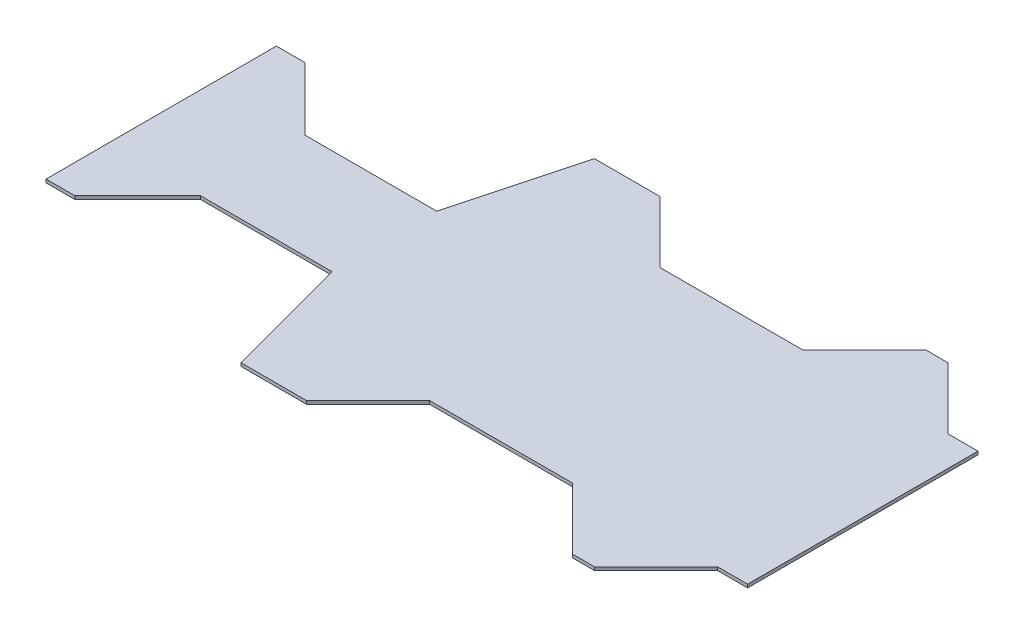
ISO-10303-21;
HEADER;
FILE_DESCRIPTION(('STEP AP214'),'2;1');
FILE_NAME('part.step','',(''),(''),'','','');
FILE_SCHEMA(('AUTOMOTIVE_DESIGN { 1 0 10303 214 1 1 1 1 }'));
ENDSEC;
DATA;
#1=APPLICATION_CONTEXT('core data for automotive mechanical design processes');
#2=APPLICATION_PROTOCOL_DEFINITION('international standard','automotive_design',2000,#1);
#3=PRODUCT_CONTEXT('',#1,'mechanical');
#4=PRODUCT('Part','Part','',(#3));
#5=PRODUCT_RELATED_PRODUCT_CATEGORY('part','',(#4));
#6=PRODUCT_DEFINITION_FORMATION('','',#4);
#7=PRODUCT_DEFINITION_CONTEXT('part definition',#1,'design');
#8=PRODUCT_DEFINITION('design','',#6,#7);
#9=PRODUCT_DEFINITION_SHAPE('','',#8);
#10=(LENGTH_UNIT() NAMED_UNIT(*) SI_UNIT(.MILLI.,.METRE.));
#11=(NAMED_UNIT(*) PLANE_ANGLE_UNIT() SI_UNIT($,.RADIAN.));
#12=(NAMED_UNIT(*) SI_UNIT($,.STERADIAN.) SOLID_ANGLE_UNIT());
#13=UNCERTAINTY_MEASURE_WITH_UNIT(LENGTH_MEASURE(1.E-05),#10,'distance_accuracy_value','');
#14=(GEOMETRIC_REPRESENTATION_CONTEXT(3) GLOBAL_UNCERTAINTY_ASSIGNED_CONTEXT((#13)) GLOBAL_UNIT_ASSIGNED_CONTEXT((#10,
#11,#12)) REPRESENTATION_CONTEXT('',''));
#15=CARTESIAN_POINT('',(0.,0.,0.));
#16=DIRECTION('',(0.,0.,1.));
#17=DIRECTION('',(1.,0.,0.));
#18=AXIS2_PLACEMENT_3D('',#15,#16,#17);
#19=CARTESIAN_POINT('',(155.575,1.5875,55.8799999999999));
#20=DIRECTION('',(0.,0.,-1.));
#21=DIRECTION('',(-1.,0.,0.));
#22=AXIS2_PLACEMENT_3D('',#19,#20,#21);
#23=PLANE('',#22);
#24=DIRECTION('',(1.,0.,0.));
#25=VECTOR('',#24,1.);
#26=CARTESIAN_POINT('',(155.575,0.,55.8799999999999));
#27=LINE('',#26,#25);
#28=CARTESIAN_POINT('',(155.575,0.,55.8799999999999));
#29=VERTEX_POINT('',#28);
#30=CARTESIAN_POINT('',(170.18,0.,55.88));
#31=VERTEX_POINT('',#30);
#32=EDGE_CURVE('E225',#29,#31,#27,.T.);
#33=ORIENTED_EDGE('',*,*,#32,.T.);
#34=DIRECTION('',(0.,-1.,0.));
#35=VECTOR('',#34,1.);
#36=CARTESIAN_POINT('',(170.18,1.5875,55.88));
#37=LINE('',#36,#35);
#38=CARTESIAN_POINT('',(170.18,1.5875,55.88));
#39=VERTEX_POINT('',#38);
#40=EDGE_CURVE('E11',#39,#31,#37,.T.);
#41=ORIENTED_EDGE('',*,*,#40,.F.);
#42=DIRECTION('',(1.,0.,0.));
#43=VECTOR('',#42,1.);
#44=CARTESIAN_POINT('',(155.575,1.5875,55.8799999999999));
#45=LINE('',#44,#43);
#46=CARTESIAN_POINT('',(155.575,1.5875,55.8799999999999));
#47=VERTEX_POINT('',#46);
#48=EDGE_CURVE('E271',#47,#39,#45,.T.);
#49=ORIENTED_EDGE('',*,*,#48,.F.);
#50=DIRECTION('',(0.,-1.,0.));
#51=VECTOR('',#50,1.);
#52=CARTESIAN_POINT('',(155.575,1.5875,55.8799999999999));
#53=LINE('',#52,#51);
#54=EDGE_CURVE('E221',#47,#29,#53,.T.);
#55=ORIENTED_EDGE('',*,*,#54,.T.);
#56=EDGE_LOOP('',(#33,#41,#49,#55));
#57=FACE_BOUND('',#56,.T.);
#58=ADVANCED_FACE('F33',(#57),#23,.F.);
#59=CARTESIAN_POINT('',(170.18,1.5875,55.88));
#60=DIRECTION('',(-1.,0.,0.));
#61=DIRECTION('',(0.,0.,1.));
#62=AXIS2_PLACEMENT_3D('',#59,#60,#61);
#63=PLANE('',#62);
#64=DIRECTION('',(0.,0.,-1.));
#65=VECTOR('',#64,1.);
#66=CARTESIAN_POINT('',(170.18,0.,55.88));
#67=LINE('',#66,#65);
#68=CARTESIAN_POINT('',(170.18,0.,-55.88));
#69=VERTEX_POINT('',#68);
#70=EDGE_CURVE('E228',#31,#69,#67,.T.);
#71=ORIENTED_EDGE('',*,*,#70,.T.);
#72=DIRECTION('',(0.,-1.,0.));
#73=VECTOR('',#72,1.);
#74=CARTESIAN_POINT('',(170.18,1.5875,-55.88));
#75=LINE('',#74,#73);
#76=CARTESIAN_POINT('',(170.18,1.5875,-55.88));
#77=VERTEX_POINT('',#76);
#78=EDGE_CURVE('E41',#77,#69,#75,.T.);
#79=ORIENTED_EDGE('',*,*,#78,.F.);
#80=DIRECTION('',(0.,0.,-1.));
#81=VECTOR('',#80,1.);
#82=CARTESIAN_POINT('',(170.18,1.5875,55.88));
#83=LINE('',#82,#81);
#84=EDGE_CURVE('E140',#39,#77,#83,.T.);
#85=ORIENTED_EDGE('',*,*,#84,.F.);
#86=ORIENTED_EDGE('',*,*,#40,.T.);
#87=EDGE_LOOP('',(#71,#79,#85,#86));
#88=FACE_BOUND('',#87,.T.);
#89=ADVANCED_FACE('F409',(#88),#63,.F.);
#90=CARTESIAN_POINT('',(155.575,1.5875,-55.8799999999999));
#91=DIRECTION('',(0.,0.,1.));
#92=DIRECTION('',(1.,0.,0.));
#93=AXIS2_PLACEMENT_3D('',#90,#91,#92);
#94=PLANE('',#93);
#95=DIRECTION('',(-1.,0.,0.));
#96=VECTOR('',#95,1.);
#97=CARTESIAN_POINT('',(155.575,0.,-55.8799999999999));
#98=LINE('',#97,#96);
#99=CARTESIAN_POINT('',(155.575,0.,-55.8799999999999));
#100=VERTEX_POINT('',#99);
#101=EDGE_CURVE('E230',#69,#100,#98,.T.);
#102=ORIENTED_EDGE('',*,*,#101,.T.);
#103=DIRECTION('',(0.,-1.,0.));
#104=VECTOR('',#103,1.);
#105=CARTESIAN_POINT('',(155.575,1.5875,-55.8799999999999));
#106=LINE('',#105,#104);
#107=CARTESIAN_POINT('',(155.575,1.5875,-55.8799999999999));
#108=VERTEX_POINT('',#107);
#109=EDGE_CURVE('E326',#108,#100,#106,.T.);
#110=ORIENTED_EDGE('',*,*,#109,.F.);
#111=DIRECTION('',(-1.,0.,0.));
#112=VECTOR('',#111,1.);
#113=CARTESIAN_POINT('',(155.575,1.5875,-55.8799999999999));
#114=LINE('',#113,#112);
#115=EDGE_CURVE('E334',#77,#108,#114,.T.);
#116=ORIENTED_EDGE('',*,*,#115,.F.);
#117=ORIENTED_EDGE('',*,*,#78,.T.);
#118=EDGE_LOOP('',(#102,#110,#116,#117));
#119=FACE_BOUND('',#118,.T.);
#120=ADVANCED_FACE('F332',(#119),#94,.F.);
#121=CARTESIAN_POINT('',(125.73,1.5875,-85.725));
#122=DIRECTION('',(-0.707106781186549,0.,0.707106781186546));
#123=DIRECTION('',(0.707106781186546,0.,0.707106781186549));
#124=AXIS2_PLACEMENT_3D('',#121,#122,#123);
#125=PLANE('',#124);
#126=DIRECTION('',(-0.707106781186546,0.,-0.707106781186549));
#127=VECTOR('',#126,1.);
#128=CARTESIAN_POINT('',(125.73,0.,-85.725));
#129=LINE('',#128,#127);
#130=CARTESIAN_POINT('',(125.73,0.,-85.725));
#131=VERTEX_POINT('',#130);
#132=EDGE_CURVE('E232',#100,#131,#129,.T.);
#133=ORIENTED_EDGE('',*,*,#132,.T.);
#134=DIRECTION('',(0.,-1.,0.));
#135=VECTOR('',#134,1.);
#136=CARTESIAN_POINT('',(125.73,1.5875,-85.725));
#137=LINE('',#136,#135);
#138=CARTESIAN_POINT('',(125.73,1.5875,-85.725));
#139=VERTEX_POINT('',#138);
#140=EDGE_CURVE('E323',#139,#131,#137,.T.);
#141=ORIENTED_EDGE('',*,*,#140,.F.);
#142=DIRECTION('',(-0.707106781186546,0.,-0.707106781186549));
#143=VECTOR('',#142,1.);
#144=CARTESIAN_POINT('',(125.73,1.5875,-85.725));
#145=LINE('',#144,#143);
#146=EDGE_CURVE('E352',#108,#139,#145,.T.);
#147=ORIENTED_EDGE('',*,*,#146,.F.);
#148=ORIENTED_EDGE('',*,*,#109,.T.);
#149=EDGE_LOOP('',(#133,#141,#147,#148));
#150=FACE_BOUND('',#149,.T.);
#151=ADVANCED_FACE('F343',(#150),#125,.F.);
#152=CARTESIAN_POINT('',(125.73,1.5875,-85.725));
#153=DIRECTION('',(0.,0.,1.));
#154=DIRECTION('',(1.,0.,0.));
#155=AXIS2_PLACEMENT_3D('',#152,#153,#154);
#156=PLANE('',#155);
#157=DIRECTION('',(-1.,0.,0.));
#158=VECTOR('',#157,1.);
#159=CARTESIAN_POINT('',(125.73,0.,-85.725));
#160=LINE('',#159,#158);
#161=CARTESIAN_POINT('',(115.177364882018,0.,-85.725));
#162=VERTEX_POINT('',#161);
#163=EDGE_CURVE('E234',#131,#162,#160,.T.);
#164=ORIENTED_EDGE('',*,*,#163,.T.);
#165=DIRECTION('',(0.,-1.,0.));
#166=VECTOR('',#165,1.);
#167=CARTESIAN_POINT('',(115.177364882018,1.5875,-85.725));
#168=LINE('',#167,#166);
#169=CARTESIAN_POINT('',(115.177364882018,1.5875,-85.725));
#170=VERTEX_POINT('',#169);
#171=EDGE_CURVE('E320',#170,#162,#168,.T.);
#172=ORIENTED_EDGE('',*,*,#171,.F.);
#173=DIRECTION('',(-1.,0.,0.));
#174=VECTOR('',#173,1.);
#175=CARTESIAN_POINT('',(125.73,1.5875,-85.725));
#176=LINE('',#175,#174);
#177=EDGE_CURVE('E349',#139,#170,#176,.T.);
#178=ORIENTED_EDGE('',*,*,#177,.F.);
#179=ORIENTED_EDGE('',*,*,#140,.T.);
#180=EDGE_LOOP('',(#164,#172,#178,#179));
#181=FACE_BOUND('',#180,.T.);
#182=ADVANCED_FACE('F347',(#181),#156,.F.);
#183=CARTESIAN_POINT('',(115.177364882018,1.5875,-85.725));
#184=DIRECTION('',(0.707106781186549,0.,0.707106781186546));
#185=DIRECTION('',(0.707106781186546,0.,-0.707106781186549));
#186=AXIS2_PLACEMENT_3D('',#183,#184,#185);
#187=PLANE('',#186);
#188=DIRECTION('',(-0.707106781186546,0.,0.707106781186549));
#189=VECTOR('',#188,1.);
#190=CARTESIAN_POINT('',(115.177364882018,0.,-85.725));
#191=LINE('',#190,#189);
#192=CARTESIAN_POINT('',(85.3323648820185,0.,-55.8799999999999));
#193=VERTEX_POINT('',#192);
#194=EDGE_CURVE('E236',#162,#193,#191,.T.);
#195=ORIENTED_EDGE('',*,*,#194,.T.);
#196=DIRECTION('',(0.,-1.,0.));
#197=VECTOR('',#196,1.);
#198=CARTESIAN_POINT('',(85.3323648820185,1.5875,-55.8799999999999));
#199=LINE('',#198,#197);
#200=CARTESIAN_POINT('',(85.3323648820185,1.5875,-55.8799999999999));
#201=VERTEX_POINT('',#200);
#202=EDGE_CURVE('E317',#201,#193,#199,.T.);
#203=ORIENTED_EDGE('',*,*,#202,.F.);
#204=DIRECTION('',(-0.707106781186546,0.,0.707106781186549));
#205=VECTOR('',#204,1.);
#206=CARTESIAN_POINT('',(115.177364882018,1.5875,-85.725));
#207=LINE('',#206,#205);
#208=EDGE_CURVE('E351',#170,#201,#207,.T.);
#209=ORIENTED_EDGE('',*,*,#208,.F.);
#210=ORIENTED_EDGE('',*,*,#171,.T.);
#211=EDGE_LOOP('',(#195,#203,#209,#210));
#212=FACE_BOUND('',#211,.T.);
#213=ADVANCED_FACE('F422',(#212),#187,.F.);
#214=CARTESIAN_POINT('',(85.3323648820185,1.5875,-55.8799999999999));
#215=DIRECTION('',(0.,0.,1.));
#216=DIRECTION('',(1.,0.,0.));
#217=AXIS2_PLACEMENT_3D('',#214,#215,#216);
#218=PLANE('',#217);
#219=DIRECTION('',(-1.,0.,0.));
#220=VECTOR('',#219,1.);
#221=CARTESIAN_POINT('',(85.3323648820185,0.,-55.8799999999999));
#222=LINE('',#221,#220);
#223=CARTESIAN_POINT('',(15.8749999999999,0.,-55.88));
#224=VERTEX_POINT('',#223);
#225=EDGE_CURVE('E238',#193,#224,#222,.T.);
#226=ORIENTED_EDGE('',*,*,#225,.T.);
#227=DIRECTION('',(0.,-1.,0.));
#228=VECTOR('',#227,1.);
#229=CARTESIAN_POINT('',(15.8749999999999,1.5875,-55.88));
#230=LINE('',#229,#228);
#231=CARTESIAN_POINT('',(15.8749999999999,1.5875,-55.88));
#232=VERTEX_POINT('',#231);
#233=EDGE_CURVE('E314',#232,#224,#230,.T.);
#234=ORIENTED_EDGE('',*,*,#233,.F.);
#235=DIRECTION('',(-1.,0.,0.));
#236=VECTOR('',#235,1.);
#237=CARTESIAN_POINT('',(85.3323648820185,1.5875,-55.8799999999999));
#238=LINE('',#237,#236);
#239=EDGE_CURVE('E354',#201,#232,#238,.T.);
#240=ORIENTED_EDGE('',*,*,#239,.F.);
#241=ORIENTED_EDGE('',*,*,#202,.T.);
#242=EDGE_LOOP('',(#226,#234,#240,#241));
#243=FACE_BOUND('',#242,.T.);
#244=ADVANCED_FACE('F425',(#243),#218,.F.);
#245=CARTESIAN_POINT('',(15.8749999999999,1.5875,-55.88));
#246=DIRECTION('',(-0.70710678118655,0.,0.707106781186545));
#247=DIRECTION('',(0.707106781186545,0.,0.70710678118655));
#248=AXIS2_PLACEMENT_3D('',#245,#246,#247);
#249=PLANE('',#248);
#250=DIRECTION('',(-0.707106781186545,0.,-0.70710678118655));
#251=VECTOR('',#250,1.);
#252=CARTESIAN_POINT('',(15.8749999999999,0.,-55.88));
#253=LINE('',#252,#251);
#254=CARTESIAN_POINT('',(-13.97,0.,-85.725));
#255=VERTEX_POINT('',#254);
#256=EDGE_CURVE('E240',#224,#255,#253,.T.);
#257=ORIENTED_EDGE('',*,*,#256,.T.);
#258=DIRECTION('',(0.,-1.,0.));
#259=VECTOR('',#258,1.);
#260=CARTESIAN_POINT('',(-13.97,1.5875,-85.725));
#261=LINE('',#260,#259);
#262=CARTESIAN_POINT('',(-13.97,1.5875,-85.725));
#263=VERTEX_POINT('',#262);
#264=EDGE_CURVE('E311',#263,#255,#261,.T.);
#265=ORIENTED_EDGE('',*,*,#264,.F.);
#266=DIRECTION('',(-0.707106781186545,0.,-0.70710678118655));
#267=VECTOR('',#266,1.);
#268=CARTESIAN_POINT('',(15.8749999999999,1.5875,-55.88));
#269=LINE('',#268,#267);
#270=EDGE_CURVE('E360',#232,#263,#269,.T.);
#271=ORIENTED_EDGE('',*,*,#270,.F.);
#272=ORIENTED_EDGE('',*,*,#233,.T.);
#273=EDGE_LOOP('',(#257,#265,#271,#272));
#274=FACE_BOUND('',#273,.T.);
#275=ADVANCED_FACE('F429',(#274),#249,.F.);
#276=CARTESIAN_POINT('',(-13.97,1.5875,-85.725));
#277=DIRECTION('',(0.,0.,1.));
#278=DIRECTION('',(1.,0.,0.));
#279=AXIS2_PLACEMENT_3D('',#276,#277,#278);
#280=PLANE('',#279);
#281=DIRECTION('',(-1.,0.,0.));
#282=VECTOR('',#281,1.);
#283=CARTESIAN_POINT('',(-13.97,0.,-85.725));
#284=LINE('',#283,#282);
#285=CARTESIAN_POINT('',(-45.72,0.,-85.725));
#286=VERTEX_POINT('',#285);
#287=EDGE_CURVE('E242',#255,#286,#284,.T.);
#288=ORIENTED_EDGE('',*,*,#287,.T.);
#289=DIRECTION('',(0.,-1.,0.));
#290=VECTOR('',#289,1.);
#291=CARTESIAN_POINT('',(-45.72,1.5875,-85.725));
#292=LINE('',#291,#290);
#293=CARTESIAN_POINT('',(-45.72,1.5875,-85.725));
#294=VERTEX_POINT('',#293);
#295=EDGE_CURVE('E308',#294,#286,#292,.T.);
#296=ORIENTED_EDGE('',*,*,#295,.F.);
#297=DIRECTION('',(-1.,0.,0.));
#298=VECTOR('',#297,1.);
#299=CARTESIAN_POINT('',(-13.97,1.5875,-85.725));
#300=LINE('',#299,#298);
#301=EDGE_CURVE('E362',#263,#294,#300,.T.);
#302=ORIENTED_EDGE('',*,*,#301,.F.);
#303=ORIENTED_EDGE('',*,*,#264,.T.);
#304=EDGE_LOOP('',(#288,#296,#302,#303));
#305=FACE_BOUND('',#304,.T.);
#306=ADVANCED_FACE('F433',(#305),#280,.F.);
#307=CARTESIAN_POINT('',(-45.72,1.5875,-85.725));
#308=DIRECTION('',(0.965925826289067,0.,0.258819045102525));
#309=DIRECTION('',(0.258819045102525,0.,-0.965925826289067));
#310=AXIS2_PLACEMENT_3D('',#307,#308,#309);
#311=PLANE('',#310);
#312=DIRECTION('',(-0.258819045102525,0.,0.965925826289067));
#313=VECTOR('',#312,1.);
#314=CARTESIAN_POINT('',(-45.72,0.,-85.725));
#315=LINE('',#314,#313);
#316=CARTESIAN_POINT('',(-61.8840350334077,0.,-25.4));
#317=VERTEX_POINT('',#316);
#318=EDGE_CURVE('E244',#286,#317,#315,.T.);
#319=ORIENTED_EDGE('',*,*,#318,.T.);
#320=DIRECTION('',(0.,-1.,0.));
#321=VECTOR('',#320,1.);
#322=CARTESIAN_POINT('',(-61.8840350334077,1.5875,-25.4));
#323=LINE('',#322,#321);
#324=CARTESIAN_POINT('',(-61.8840350334077,1.5875,-25.4));
#325=VERTEX_POINT('',#324);
#326=EDGE_CURVE('E305',#325,#317,#323,.T.);
#327=ORIENTED_EDGE('',*,*,#326,.F.);
#328=DIRECTION('',(-0.258819045102525,0.,0.965925826289067));
#329=VECTOR('',#328,1.);
#330=CARTESIAN_POINT('',(-45.72,1.5875,-85.725));
#331=LINE('',#330,#329);
#332=EDGE_CURVE('E364',#294,#325,#331,.T.);
#333=ORIENTED_EDGE('',*,*,#332,.F.);
#334=ORIENTED_EDGE('',*,*,#295,.T.);
#335=EDGE_LOOP('',(#319,#327,#333,#334));
#336=FACE_BOUND('',#335,.T.);
#337=ADVANCED_FACE('F437',(#336),#311,.F.);
#338=CARTESIAN_POINT('',(-125.73,1.5875,-25.4));
#339=DIRECTION('',(0.,0.,1.));
#340=DIRECTION('',(1.,0.,0.));
#341=AXIS2_PLACEMENT_3D('',#338,#339,#340);
#342=PLANE('',#341);
#343=DIRECTION('',(-1.,0.,0.));
#344=VECTOR('',#343,1.);
#345=CARTESIAN_POINT('',(-125.73,0.,-25.4));
#346=LINE('',#345,#344);
#347=CARTESIAN_POINT('',(-125.73,0.,-25.4));
#348=VERTEX_POINT('',#347);
#349=EDGE_CURVE('E246',#317,#348,#346,.T.);
#350=ORIENTED_EDGE('',*,*,#349,.T.);
#351=DIRECTION('',(0.,-1.,0.));
#352=VECTOR('',#351,1.);
#353=CARTESIAN_POINT('',(-125.73,1.5875,-25.4));
#354=LINE('',#353,#352);
#355=CARTESIAN_POINT('',(-125.73,1.5875,-25.4));
#356=VERTEX_POINT('',#355);
#357=EDGE_CURVE('E302',#356,#348,#354,.T.);
#358=ORIENTED_EDGE('',*,*,#357,.F.);
#359=DIRECTION('',(-1.,0.,0.));
#360=VECTOR('',#359,1.);
#361=CARTESIAN_POINT('',(-125.73,1.5875,-25.4));
#362=LINE('',#361,#360);
#363=EDGE_CURVE('E366',#325,#356,#362,.T.);
#364=ORIENTED_EDGE('',*,*,#363,.F.);
#365=ORIENTED_EDGE('',*,*,#326,.T.);
#366=EDGE_LOOP('',(#350,#358,#364,#365));
#367=FACE_BOUND('',#366,.T.);
#368=ADVANCED_FACE('F441',(#367),#342,.F.);
#369=CARTESIAN_POINT('',(-156.21,1.5875,-55.88));
#370=DIRECTION('',(-0.707106781186549,0.,0.707106781186546));
#371=DIRECTION('',(0.707106781186546,0.,0.707106781186549));
#372=AXIS2_PLACEMENT_3D('',#369,#370,#371);
#373=PLANE('',#372);
#374=DIRECTION('',(-0.707106781186546,0.,-0.707106781186549));
#375=VECTOR('',#374,1.);
#376=CARTESIAN_POINT('',(-156.21,0.,-55.88));
#377=LINE('',#376,#375);
#378=CARTESIAN_POINT('',(-156.21,0.,-55.88));
#379=VERTEX_POINT('',#378);
#380=EDGE_CURVE('E248',#348,#379,#377,.T.);
#381=ORIENTED_EDGE('',*,*,#380,.T.);
#382=DIRECTION('',(0.,-1.,0.));
#383=VECTOR('',#382,1.);
#384=CARTESIAN_POINT('',(-156.21,1.5875,-55.88));
#385=LINE('',#384,#383);
#386=CARTESIAN_POINT('',(-156.21,1.5875,-55.88));
#387=VERTEX_POINT('',#386);
#388=EDGE_CURVE('E299',#387,#379,#385,.T.);
#389=ORIENTED_EDGE('',*,*,#388,.F.);
#390=DIRECTION('',(-0.707106781186546,0.,-0.707106781186549));
#391=VECTOR('',#390,1.);
#392=CARTESIAN_POINT('',(-156.21,1.5875,-55.88));
#393=LINE('',#392,#391);
#394=EDGE_CURVE('E368',#356,#387,#393,.T.);
#395=ORIENTED_EDGE('',*,*,#394,.F.);
#396=ORIENTED_EDGE('',*,*,#357,.T.);
#397=EDGE_LOOP('',(#381,#389,#395,#396));
#398=FACE_BOUND('',#397,.T.);
#399=ADVANCED_FACE('F445',(#398),#373,.F.);
#400=CARTESIAN_POINT('',(-170.18,1.5875,-55.88));
#401=DIRECTION('',(0.,0.,1.));
#402=DIRECTION('',(1.,0.,0.));
#403=AXIS2_PLACEMENT_3D('',#400,#401,#402);
#404=PLANE('',#403);
#405=DIRECTION('',(-1.,0.,0.));
#406=VECTOR('',#405,1.);
#407=CARTESIAN_POINT('',(-170.18,0.,-55.88));
#408=LINE('',#407,#406);
#409=CARTESIAN_POINT('',(-170.18,0.,-55.88));
#410=VERTEX_POINT('',#409);
#411=EDGE_CURVE('E250',#379,#410,#408,.T.);
#412=ORIENTED_EDGE('',*,*,#411,.T.);
#413=DIRECTION('',(0.,-1.,0.));
#414=VECTOR('',#413,1.);
#415=CARTESIAN_POINT('',(-170.18,1.5875,-55.88));
#416=LINE('',#415,#414);
#417=CARTESIAN_POINT('',(-170.18,1.5875,-55.88));
#418=VERTEX_POINT('',#417);
#419=EDGE_CURVE('E296',#418,#410,#416,.T.);
#420=ORIENTED_EDGE('',*,*,#419,.F.);
#421=DIRECTION('',(-1.,0.,0.));
#422=VECTOR('',#421,1.);
#423=CARTESIAN_POINT('',(-170.18,1.5875,-55.88));
#424=LINE('',#423,#422);
#425=EDGE_CURVE('E370',#387,#418,#424,.T.);
#426=ORIENTED_EDGE('',*,*,#425,.F.);
#427=ORIENTED_EDGE('',*,*,#388,.T.);
#428=EDGE_LOOP('',(#412,#420,#426,#427));
#429=FACE_BOUND('',#428,.T.);
#430=ADVANCED_FACE('F449',(#429),#404,.F.);
#431=CARTESIAN_POINT('',(-170.18,1.5875,55.88));
#432=DIRECTION('',(1.,0.,0.));
#433=DIRECTION('',(0.,0.,-1.));
#434=AXIS2_PLACEMENT_3D('',#431,#432,#433);
#435=PLANE('',#434);
#436=DIRECTION('',(0.,0.,1.));
#437=VECTOR('',#436,1.);
#438=CARTESIAN_POINT('',(-170.18,0.,55.88));
#439=LINE('',#438,#437);
#440=CARTESIAN_POINT('',(-170.18,0.,55.88));
#441=VERTEX_POINT('',#440);
#442=EDGE_CURVE('E252',#410,#441,#439,.T.);
#443=ORIENTED_EDGE('',*,*,#442,.T.);
#444=DIRECTION('',(0.,-1.,0.));
#445=VECTOR('',#444,1.);
#446=CARTESIAN_POINT('',(-170.18,1.5875,55.88));
#447=LINE('',#446,#445);
#448=CARTESIAN_POINT('',(-170.18,1.5875,55.88));
#449=VERTEX_POINT('',#448);
#450=EDGE_CURVE('E293',#449,#441,#447,.T.);
#451=ORIENTED_EDGE('',*,*,#450,.F.);
#452=DIRECTION('',(0.,0.,1.));
#453=VECTOR('',#452,1.);
#454=CARTESIAN_POINT('',(-170.18,1.5875,55.88));
#455=LINE('',#454,#453);
#456=EDGE_CURVE('E372',#418,#449,#455,.T.);
#457=ORIENTED_EDGE('',*,*,#456,.F.);
#458=ORIENTED_EDGE('',*,*,#419,.T.);
#459=EDGE_LOOP('',(#443,#451,#457,#458));
#460=FACE_BOUND('',#459,.T.);
#461=ADVANCED_FACE('F453',(#460),#435,.F.);
#462=CARTESIAN_POINT('',(-170.18,1.5875,55.88));
#463=DIRECTION('',(0.,0.,-1.));
#464=DIRECTION('',(-1.,0.,0.));
#465=AXIS2_PLACEMENT_3D('',#462,#463,#464);
#466=PLANE('',#465);
#467=DIRECTION('',(1.,0.,0.));
#468=VECTOR('',#467,1.);
#469=CARTESIAN_POINT('',(-170.18,0.,55.88));
#470=LINE('',#469,#468);
#471=CARTESIAN_POINT('',(-156.21,0.,55.88));
#472=VERTEX_POINT('',#471);
#473=EDGE_CURVE('E254',#441,#472,#470,.T.);
#474=ORIENTED_EDGE('',*,*,#473,.T.);
#475=DIRECTION('',(0.,-1.,0.));
#476=VECTOR('',#475,1.);
#477=CARTESIAN_POINT('',(-156.21,1.5875,55.88));
#478=LINE('',#477,#476);
#479=CARTESIAN_POINT('',(-156.21,1.5875,55.88));
#480=VERTEX_POINT('',#479);
#481=EDGE_CURVE('E290',#480,#472,#478,.T.);
#482=ORIENTED_EDGE('',*,*,#481,.F.);
#483=DIRECTION('',(1.,0.,0.));
#484=VECTOR('',#483,1.);
#485=CARTESIAN_POINT('',(-170.18,1.5875,55.88));
#486=LINE('',#485,#484);
#487=EDGE_CURVE('E374',#449,#480,#486,.T.);
#488=ORIENTED_EDGE('',*,*,#487,.F.);
#489=ORIENTED_EDGE('',*,*,#450,.T.);
#490=EDGE_LOOP('',(#474,#482,#488,#489));
#491=FACE_BOUND('',#490,.T.);
#492=ADVANCED_FACE('F457',(#491),#466,.F.);
#493=CARTESIAN_POINT('',(-156.21,1.5875,55.88));
#494=DIRECTION('',(-0.707106781186549,0.,-0.707106781186545));
#495=DIRECTION('',(-0.707106781186546,0.,0.70710678118655));
#496=AXIS2_PLACEMENT_3D('',#493,#494,#495);
#497=PLANE('',#496);
#498=DIRECTION('',(0.707106781186546,0.,-0.707106781186549));
#499=VECTOR('',#498,1.);
#500=CARTESIAN_POINT('',(-156.21,0.,55.88));
#501=LINE('',#500,#499);
#502=CARTESIAN_POINT('',(-125.73,0.,25.4));
#503=VERTEX_POINT('',#502);
#504=EDGE_CURVE('E256',#472,#503,#501,.T.);
#505=ORIENTED_EDGE('',*,*,#504,.T.);
#506=DIRECTION('',(0.,-1.,0.));
#507=VECTOR('',#506,1.);
#508=CARTESIAN_POINT('',(-125.73,1.5875,25.4));
#509=LINE('',#508,#507);
#510=CARTESIAN_POINT('',(-125.73,1.5875,25.4));
#511=VERTEX_POINT('',#510);
#512=EDGE_CURVE('E287',#511,#503,#509,.T.);
#513=ORIENTED_EDGE('',*,*,#512,.F.);
#514=DIRECTION('',(0.707106781186546,0.,-0.707106781186549));
#515=VECTOR('',#514,1.);
#516=CARTESIAN_POINT('',(-156.21,1.5875,55.88));
#517=LINE('',#516,#515);
#518=EDGE_CURVE('E376',#480,#511,#517,.T.);
#519=ORIENTED_EDGE('',*,*,#518,.F.);
#520=ORIENTED_EDGE('',*,*,#481,.T.);
#521=EDGE_LOOP('',(#505,#513,#519,#520));
#522=FACE_BOUND('',#521,.T.);
#523=ADVANCED_FACE('F461',(#522),#497,.F.);
#524=CARTESIAN_POINT('',(-125.73,1.5875,25.4));
#525=DIRECTION('',(0.,0.,-1.));
#526=DIRECTION('',(-1.,0.,0.));
#527=AXIS2_PLACEMENT_3D('',#524,#525,#526);
#528=PLANE('',#527);
#529=DIRECTION('',(1.,0.,0.));
#530=VECTOR('',#529,1.);
#531=CARTESIAN_POINT('',(-125.73,0.,25.4));
#532=LINE('',#531,#530);
#533=CARTESIAN_POINT('',(-61.8840350334077,0.,25.4));
#534=VERTEX_POINT('',#533);
#535=EDGE_CURVE('E258',#503,#534,#532,.T.);
#536=ORIENTED_EDGE('',*,*,#535,.T.);
#537=DIRECTION('',(0.,-1.,0.));
#538=VECTOR('',#537,1.);
#539=CARTESIAN_POINT('',(-61.8840350334077,1.5875,25.4));
#540=LINE('',#539,#538);
#541=CARTESIAN_POINT('',(-61.8840350334077,1.5875,25.4));
#542=VERTEX_POINT('',#541);
#543=EDGE_CURVE('E284',#542,#534,#540,.T.);
#544=ORIENTED_EDGE('',*,*,#543,.F.);
#545=DIRECTION('',(1.,0.,0.));
#546=VECTOR('',#545,1.);
#547=CARTESIAN_POINT('',(-125.73,1.5875,25.4));
#548=LINE('',#547,#546);
#549=EDGE_CURVE('E378',#511,#542,#548,.T.);
#550=ORIENTED_EDGE('',*,*,#549,.F.);
#551=ORIENTED_EDGE('',*,*,#512,.T.);
#552=EDGE_LOOP('',(#536,#544,#550,#551));
#553=FACE_BOUND('',#552,.T.);
#554=ADVANCED_FACE('F465',(#553),#528,.F.);
#555=CARTESIAN_POINT('',(-45.72,1.5875,85.725));
#556=DIRECTION('',(0.965925826289067,0.,-0.258819045102525));
#557=DIRECTION('',(-0.258819045102525,0.,-0.965925826289067));
#558=AXIS2_PLACEMENT_3D('',#555,#556,#557);
#559=PLANE('',#558);
#560=DIRECTION('',(0.258819045102525,0.,0.965925826289067));
#561=VECTOR('',#560,1.);
#562=CARTESIAN_POINT('',(-45.72,0.,85.725));
#563=LINE('',#562,#561);
#564=CARTESIAN_POINT('',(-45.72,0.,85.725));
#565=VERTEX_POINT('',#564);
#566=EDGE_CURVE('E260',#534,#565,#563,.T.);
#567=ORIENTED_EDGE('',*,*,#566,.T.);
#568=DIRECTION('',(0.,-1.,0.));
#569=VECTOR('',#568,1.);
#570=CARTESIAN_POINT('',(-45.72,1.5875,85.725));
#571=LINE('',#570,#569);
#572=CARTESIAN_POINT('',(-45.72,1.5875,85.725));
#573=VERTEX_POINT('',#572);
#574=EDGE_CURVE('E281',#573,#565,#571,.T.);
#575=ORIENTED_EDGE('',*,*,#574,.F.);
#576=DIRECTION('',(0.258819045102525,0.,0.965925826289067));
#577=VECTOR('',#576,1.);
#578=CARTESIAN_POINT('',(-45.72,1.5875,85.725));
#579=LINE('',#578,#577);
#580=EDGE_CURVE('E380',#542,#573,#579,.T.);
#581=ORIENTED_EDGE('',*,*,#580,.F.);
#582=ORIENTED_EDGE('',*,*,#543,.T.);
#583=EDGE_LOOP('',(#567,#575,#581,#582));
#584=FACE_BOUND('',#583,.T.);
#585=ADVANCED_FACE('F469',(#584),#559,.F.);
#586=CARTESIAN_POINT('',(-13.97,1.5875,85.725));
#587=DIRECTION('',(0.,0.,-1.));
#588=DIRECTION('',(-1.,0.,0.));
#589=AXIS2_PLACEMENT_3D('',#586,#587,#588);
#590=PLANE('',#589);
#591=DIRECTION('',(1.,0.,0.));
#592=VECTOR('',#591,1.);
#593=CARTESIAN_POINT('',(-13.97,0.,85.725));
#594=LINE('',#593,#592);
#595=CARTESIAN_POINT('',(-13.97,0.,85.725));
#596=VERTEX_POINT('',#595);
#597=EDGE_CURVE('E262',#565,#596,#594,.T.);
#598=ORIENTED_EDGE('',*,*,#597,.T.);
#599=DIRECTION('',(0.,-1.,0.));
#600=VECTOR('',#599,1.);
#601=CARTESIAN_POINT('',(-13.97,1.5875,85.725));
#602=LINE('',#601,#600);
#603=CARTESIAN_POINT('',(-13.97,1.5875,85.725));
#604=VERTEX_POINT('',#603);
#605=EDGE_CURVE('E278',#604,#596,#602,.T.);
#606=ORIENTED_EDGE('',*,*,#605,.F.);
#607=DIRECTION('',(1.,0.,0.));
#608=VECTOR('',#607,1.);
#609=CARTESIAN_POINT('',(-13.97,1.5875,85.725));
#610=LINE('',#609,#608);
#611=EDGE_CURVE('E382',#573,#604,#610,.T.);
#612=ORIENTED_EDGE('',*,*,#611,.F.);
#613=ORIENTED_EDGE('',*,*,#574,.T.);
#614=EDGE_LOOP('',(#598,#606,#612,#613));
#615=FACE_BOUND('',#614,.T.);
#616=ADVANCED_FACE('F473',(#615),#590,.F.);
#617=CARTESIAN_POINT('',(15.8749999999999,1.5875,55.88));
#618=DIRECTION('',(-0.707106781186549,0.,-0.707106781186546));
#619=DIRECTION('',(-0.707106781186546,0.,0.707106781186549));
#620=AXIS2_PLACEMENT_3D('',#617,#618,#619);
#621=PLANE('',#620);
#622=DIRECTION('',(0.707106781186546,0.,-0.707106781186549));
#623=VECTOR('',#622,1.);
#624=CARTESIAN_POINT('',(15.8749999999999,0.,55.88));
#625=LINE('',#624,#623);
#626=CARTESIAN_POINT('',(15.8749999999999,0.,55.88));
#627=VERTEX_POINT('',#626);
#628=EDGE_CURVE('E264',#596,#627,#625,.T.);
#629=ORIENTED_EDGE('',*,*,#628,.T.);
#630=DIRECTION('',(0.,-1.,0.));
#631=VECTOR('',#630,1.);
#632=CARTESIAN_POINT('',(15.8749999999999,1.5875,55.88));
#633=LINE('',#632,#631);
#634=CARTESIAN_POINT('',(15.8749999999999,1.5875,55.88));
#635=VERTEX_POINT('',#634);
#636=EDGE_CURVE('E275',#635,#627,#633,.T.);
#637=ORIENTED_EDGE('',*,*,#636,.F.);
#638=DIRECTION('',(0.707106781186546,0.,-0.707106781186549));
#639=VECTOR('',#638,1.);
#640=CARTESIAN_POINT('',(15.8749999999999,1.5875,55.88));
#641=LINE('',#640,#639);
#642=EDGE_CURVE('E384',#604,#635,#641,.T.);
#643=ORIENTED_EDGE('',*,*,#642,.F.);
#644=ORIENTED_EDGE('',*,*,#605,.T.);
#645=EDGE_LOOP('',(#629,#637,#643,#644));
#646=FACE_BOUND('',#645,.T.);
#647=ADVANCED_FACE('F390',(#646),#621,.F.);
#648=CARTESIAN_POINT('',(85.3323648820185,1.5875,55.8799999999999));
#649=DIRECTION('',(0.,0.,-1.));
#650=DIRECTION('',(-1.,0.,0.));
#651=AXIS2_PLACEMENT_3D('',#648,#649,#650);
#652=PLANE('',#651);
#653=DIRECTION('',(1.,0.,0.));
#654=VECTOR('',#653,1.);
#655=CARTESIAN_POINT('',(85.3323648820185,0.,55.8799999999999));
#656=LINE('',#655,#654);
#657=CARTESIAN_POINT('',(85.3323648820185,0.,55.8799999999999));
#658=VERTEX_POINT('',#657);
#659=EDGE_CURVE('E266',#627,#658,#656,.T.);
#660=ORIENTED_EDGE('',*,*,#659,.T.);
#661=DIRECTION('',(0.,-1.,0.));
#662=VECTOR('',#661,1.);
#663=CARTESIAN_POINT('',(85.3323648820185,1.5875,55.8799999999999));
#664=LINE('',#663,#662);
#665=CARTESIAN_POINT('',(85.3323648820185,1.5875,55.8799999999999));
#666=VERTEX_POINT('',#665);
#667=EDGE_CURVE('E216',#666,#658,#664,.T.);
#668=ORIENTED_EDGE('',*,*,#667,.F.);
#669=DIRECTION('',(1.,0.,0.));
#670=VECTOR('',#669,1.);
#671=CARTESIAN_POINT('',(85.3323648820185,1.5875,55.8799999999999));
#672=LINE('',#671,#670);
#673=EDGE_CURVE('E207',#635,#666,#672,.T.);
#674=ORIENTED_EDGE('',*,*,#673,.F.);
#675=ORIENTED_EDGE('',*,*,#636,.T.);
#676=EDGE_LOOP('',(#660,#668,#674,#675));
#677=FACE_BOUND('',#676,.T.);
#678=ADVANCED_FACE('F394',(#677),#652,.F.);
#679=CARTESIAN_POINT('',(115.177364882018,1.5875,85.725));
#680=DIRECTION('',(0.707106781186549,0.,-0.707106781186546));
#681=DIRECTION('',(-0.707106781186546,0.,-0.707106781186549));
#682=AXIS2_PLACEMENT_3D('',#679,#680,#681);
#683=PLANE('',#682);
#684=DIRECTION('',(0.707106781186546,0.,0.707106781186549));
#685=VECTOR('',#684,1.);
#686=CARTESIAN_POINT('',(115.177364882018,0.,85.725));
#687=LINE('',#686,#685);
#688=CARTESIAN_POINT('',(115.177364882018,0.,85.725));
#689=VERTEX_POINT('',#688);
#690=EDGE_CURVE('E215',#658,#689,#687,.T.);
#691=ORIENTED_EDGE('',*,*,#690,.T.);
#692=DIRECTION('',(0.,-1.,0.));
#693=VECTOR('',#692,1.);
#694=CARTESIAN_POINT('',(115.177364882018,1.5875,85.725));
#695=LINE('',#694,#693);
#696=CARTESIAN_POINT('',(115.177364882018,1.5875,85.725));
#697=VERTEX_POINT('',#696);
#698=EDGE_CURVE('E212',#697,#689,#695,.T.);
#699=ORIENTED_EDGE('',*,*,#698,.F.);
#700=DIRECTION('',(0.707106781186546,0.,0.707106781186549));
#701=VECTOR('',#700,1.);
#702=CARTESIAN_POINT('',(115.177364882018,1.5875,85.725));
#703=LINE('',#702,#701);
#704=EDGE_CURVE('E201',#666,#697,#703,.T.);
#705=ORIENTED_EDGE('',*,*,#704,.F.);
#706=ORIENTED_EDGE('',*,*,#667,.T.);
#707=EDGE_LOOP('',(#691,#699,#705,#706));
#708=FACE_BOUND('',#707,.T.);
#709=ADVANCED_FACE('F213',(#708),#683,.F.);
#710=CARTESIAN_POINT('',(125.73,1.5875,85.725));
#711=DIRECTION('',(0.,0.,-1.));
#712=DIRECTION('',(-1.,0.,0.));
#713=AXIS2_PLACEMENT_3D('',#710,#711,#712);
#714=PLANE('',#713);
#715=DIRECTION('',(1.,0.,0.));
#716=VECTOR('',#715,1.);
#717=CARTESIAN_POINT('',(125.73,0.,85.725));
#718=LINE('',#717,#716);
#719=CARTESIAN_POINT('',(125.73,0.,85.725));
#720=VERTEX_POINT('',#719);
#721=EDGE_CURVE('E126',#689,#720,#718,.T.);
#722=ORIENTED_EDGE('',*,*,#721,.T.);
#723=DIRECTION('',(0.,-1.,0.));
#724=VECTOR('',#723,1.);
#725=CARTESIAN_POINT('',(125.73,1.5875,85.725));
#726=LINE('',#725,#724);
#727=CARTESIAN_POINT('',(125.73,1.5875,85.725));
#728=VERTEX_POINT('',#727);
#729=EDGE_CURVE('E217',#728,#720,#726,.T.);
#730=ORIENTED_EDGE('',*,*,#729,.F.);
#731=DIRECTION('',(1.,0.,0.));
#732=VECTOR('',#731,1.);
#733=CARTESIAN_POINT('',(125.73,1.5875,85.725));
#734=LINE('',#733,#732);
#735=EDGE_CURVE('E205',#697,#728,#734,.T.);
#736=ORIENTED_EDGE('',*,*,#735,.F.);
#737=ORIENTED_EDGE('',*,*,#698,.T.);
#738=EDGE_LOOP('',(#722,#730,#736,#737));
#739=FACE_BOUND('',#738,.T.);
#740=ADVANCED_FACE('F219',(#739),#714,.F.);
#741=CARTESIAN_POINT('',(125.73,1.5875,85.725));
#742=DIRECTION('',(-0.707106781186549,0.,-0.707106781186546));
#743=DIRECTION('',(-0.707106781186546,0.,0.707106781186549));
#744=AXIS2_PLACEMENT_3D('',#741,#742,#743);
#745=PLANE('',#744);
#746=DIRECTION('',(0.707106781186546,0.,-0.707106781186549));
#747=VECTOR('',#746,1.);
#748=CARTESIAN_POINT('',(125.73,0.,85.725));
#749=LINE('',#748,#747);
#750=EDGE_CURVE('E132',#720,#29,#749,.T.);
#751=ORIENTED_EDGE('',*,*,#750,.T.);
#752=ORIENTED_EDGE('',*,*,#54,.F.);
#753=DIRECTION('',(0.707106781186546,0.,-0.707106781186549));
#754=VECTOR('',#753,1.);
#755=CARTESIAN_POINT('',(125.73,1.5875,85.725));
#756=LINE('',#755,#754);
#757=EDGE_CURVE('E49',#728,#47,#756,.T.);
#758=ORIENTED_EDGE('',*,*,#757,.F.);
#759=ORIENTED_EDGE('',*,*,#729,.T.);
#760=EDGE_LOOP('',(#751,#752,#758,#759));
#761=FACE_BOUND('',#760,.T.);
#762=ADVANCED_FACE('F398',(#761),#745,.F.);
#763=CARTESIAN_POINT('',(170.18,1.5875,55.88));
#764=DIRECTION('',(0.,1.,0.));
#765=DIRECTION('',(0.,0.,1.));
#766=AXIS2_PLACEMENT_3D('',#763,#764,#765);
#767=PLANE('',#766);
#768=ORIENTED_EDGE('',*,*,#48,.T.);
#769=ORIENTED_EDGE('',*,*,#84,.T.);
#770=ORIENTED_EDGE('',*,*,#115,.T.);
#771=ORIENTED_EDGE('',*,*,#146,.T.);
#772=ORIENTED_EDGE('',*,*,#177,.T.);
#773=ORIENTED_EDGE('',*,*,#208,.T.);
#774=ORIENTED_EDGE('',*,*,#239,.T.);
#775=ORIENTED_EDGE('',*,*,#270,.T.);
#776=ORIENTED_EDGE('',*,*,#301,.T.);
#777=ORIENTED_EDGE('',*,*,#332,.T.);
#778=ORIENTED_EDGE('',*,*,#363,.T.);
#779=ORIENTED_EDGE('',*,*,#394,.T.);
#780=ORIENTED_EDGE('',*,*,#425,.T.);
#781=ORIENTED_EDGE('',*,*,#456,.T.);
#782=ORIENTED_EDGE('',*,*,#487,.T.);
#783=ORIENTED_EDGE('',*,*,#518,.T.);
#784=ORIENTED_EDGE('',*,*,#549,.T.);
#785=ORIENTED_EDGE('',*,*,#580,.T.);
#786=ORIENTED_EDGE('',*,*,#611,.T.);
#787=ORIENTED_EDGE('',*,*,#642,.T.);
#788=ORIENTED_EDGE('',*,*,#673,.T.);
#789=ORIENTED_EDGE('',*,*,#704,.T.);
#790=ORIENTED_EDGE('',*,*,#735,.T.);
#791=ORIENTED_EDGE('',*,*,#757,.T.);
#792=EDGE_LOOP('',(#768,#769,#770,#771,#772,#773,#774,#775,#776,#777,#778,#779,#780,#781,#782,
#783,#784,#785,#786,#787,#788,#789,#790,#791));
#793=FACE_BOUND('',#792,.T.);
#794=ADVANCED_FACE('F203',(#793),#767,.T.);
#795=CARTESIAN_POINT('',(170.18,0.,55.88));
#796=DIRECTION('',(0.,1.,0.));
#797=DIRECTION('',(0.,0.,1.));
#798=AXIS2_PLACEMENT_3D('',#795,#796,#797);
#799=PLANE('',#798);
#800=ORIENTED_EDGE('',*,*,#32,.F.);
#801=ORIENTED_EDGE('',*,*,#750,.F.);
#802=ORIENTED_EDGE('',*,*,#721,.F.);
#803=ORIENTED_EDGE('',*,*,#690,.F.);
#804=ORIENTED_EDGE('',*,*,#659,.F.);
#805=ORIENTED_EDGE('',*,*,#628,.F.);
#806=ORIENTED_EDGE('',*,*,#597,.F.);
#807=ORIENTED_EDGE('',*,*,#566,.F.);
#808=ORIENTED_EDGE('',*,*,#535,.F.);
#809=ORIENTED_EDGE('',*,*,#504,.F.);
#810=ORIENTED_EDGE('',*,*,#473,.F.);
#811=ORIENTED_EDGE('',*,*,#442,.F.);
#812=ORIENTED_EDGE('',*,*,#411,.F.);
#813=ORIENTED_EDGE('',*,*,#380,.F.);
#814=ORIENTED_EDGE('',*,*,#349,.F.);
#815=ORIENTED_EDGE('',*,*,#318,.F.);
#816=ORIENTED_EDGE('',*,*,#287,.F.);
#817=ORIENTED_EDGE('',*,*,#256,.F.);
#818=ORIENTED_EDGE('',*,*,#225,.F.);
#819=ORIENTED_EDGE('',*,*,#194,.F.);
#820=ORIENTED_EDGE('',*,*,#163,.F.);
#821=ORIENTED_EDGE('',*,*,#132,.F.);
#822=ORIENTED_EDGE('',*,*,#101,.F.);
#823=ORIENTED_EDGE('',*,*,#70,.F.);
#824=EDGE_LOOP('',(#800,#801,#802,#803,#804,#805,#806,#807,#808,#809,#810,#811,#812,#813,#814,
#815,#816,#817,#818,#819,#820,#821,#822,#823));
#825=FACE_BOUND('',#824,.T.);
#826=ADVANCED_FACE('F338',(#825),#799,.F.);
#827=CLOSED_SHELL('',(#58,#89,#120,#151,#182,#213,#244,#275,#306,#337,#368,#399,#430,#461,#492,
#523,#554,#585,#616,#647,#678,#709,#740,#762,#794,#826));
#828=MANIFOLD_SOLID_BREP('B2',#827);
#829=ADVANCED_BREP_SHAPE_REPRESENTATION('',(#18,#828),#14);
#830=SHAPE_DEFINITION_REPRESENTATION(#9,#829);
ENDSEC;
END-ISO-10303-21;
